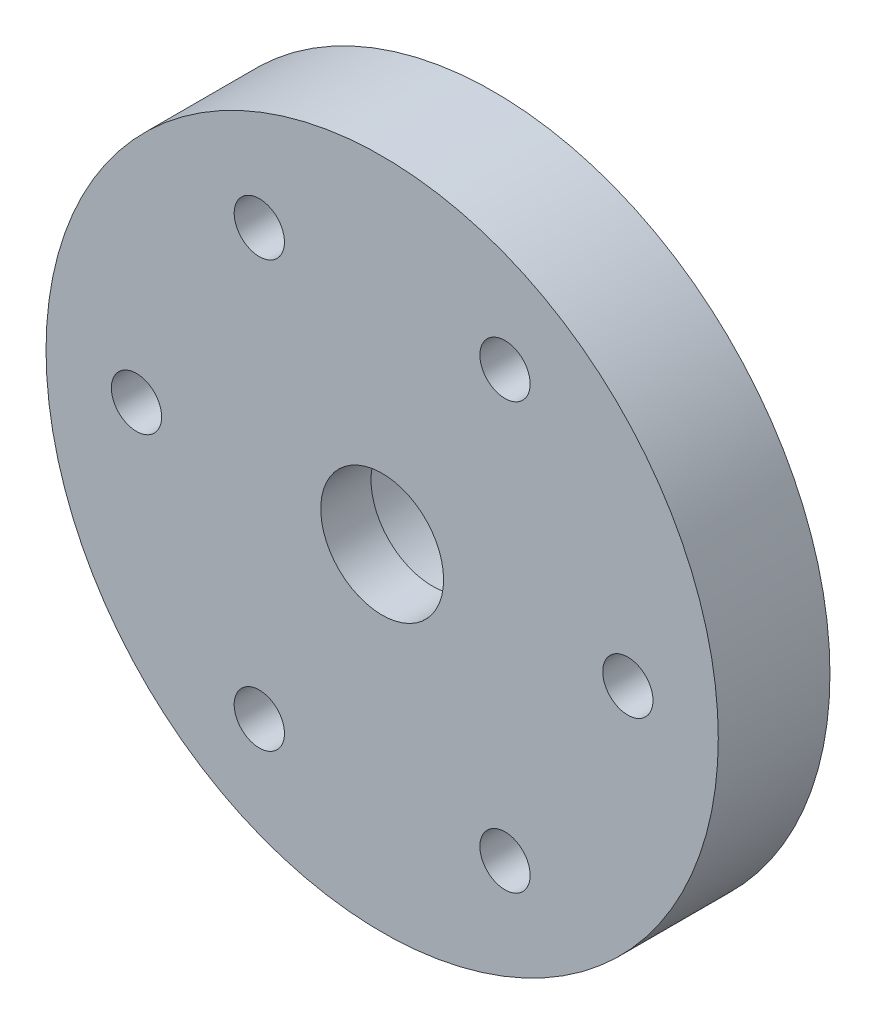
ISO-10303-21;
HEADER;
FILE_DESCRIPTION(('STEP AP214'),'2;1');
FILE_NAME('part.step','',(''),(''),'','','');
FILE_SCHEMA(('AUTOMOTIVE_DESIGN { 1 0 10303 214 1 1 1 1 }'));
ENDSEC;
DATA;
#1=APPLICATION_CONTEXT('core data for automotive mechanical design processes');
#2=APPLICATION_PROTOCOL_DEFINITION('international standard','automotive_design',2000,#1);
#3=PRODUCT_CONTEXT('',#1,'mechanical');
#4=PRODUCT('Part','Part','',(#3));
#5=PRODUCT_RELATED_PRODUCT_CATEGORY('part','',(#4));
#6=PRODUCT_DEFINITION_FORMATION('','',#4);
#7=PRODUCT_DEFINITION_CONTEXT('part definition',#1,'design');
#8=PRODUCT_DEFINITION('design','',#6,#7);
#9=PRODUCT_DEFINITION_SHAPE('','',#8);
#10=(LENGTH_UNIT() NAMED_UNIT(*) SI_UNIT(.MILLI.,.METRE.));
#11=(NAMED_UNIT(*) PLANE_ANGLE_UNIT() SI_UNIT($,.RADIAN.));
#12=(NAMED_UNIT(*) SI_UNIT($,.STERADIAN.) SOLID_ANGLE_UNIT());
#13=UNCERTAINTY_MEASURE_WITH_UNIT(LENGTH_MEASURE(1.E-05),#10,'distance_accuracy_value','');
#14=(GEOMETRIC_REPRESENTATION_CONTEXT(3) GLOBAL_UNCERTAINTY_ASSIGNED_CONTEXT((#13)) GLOBAL_UNIT_ASSIGNED_CONTEXT((#10,
#11,#12)) REPRESENTATION_CONTEXT('',''));
#15=CARTESIAN_POINT('',(0.,0.,0.));
#16=DIRECTION('',(0.,0.,1.));
#17=DIRECTION('',(1.,0.,0.));
#18=AXIS2_PLACEMENT_3D('',#15,#16,#17);
#19=CARTESIAN_POINT('',(0.,0.,10.));
#20=DIRECTION('',(0.,0.,-1.));
#21=DIRECTION('',(-1.,0.,0.));
#22=AXIS2_PLACEMENT_3D('',#19,#20,#21);
#23=CYLINDRICAL_SURFACE('',#22,8.1);
#24=CARTESIAN_POINT('',(0.,0.,0.));
#25=DIRECTION('',(0.,0.,1.));
#26=DIRECTION('',(1.,0.,0.));
#27=AXIS2_PLACEMENT_3D('',#24,#25,#26);
#28=CIRCLE('',#27,8.1);
#29=CARTESIAN_POINT('',(8.1,0.,0.));
#30=VERTEX_POINT('',#29);
#31=EDGE_CURVE('E123',#30,#30,#28,.T.);
#32=ORIENTED_EDGE('',*,*,#31,.F.);
#33=EDGE_LOOP('',(#32));
#34=FACE_BOUND('',#33,.T.);
#35=CARTESIAN_POINT('',(0.,0.,5.5));
#36=DIRECTION('',(0.,0.,1.));
#37=DIRECTION('',(1.,0.,0.));
#38=AXIS2_PLACEMENT_3D('',#35,#36,#37);
#39=CIRCLE('',#38,8.1);
#40=CARTESIAN_POINT('',(8.1,0.,5.5));
#41=VERTEX_POINT('',#40);
#42=EDGE_CURVE('E128',#41,#41,#39,.T.);
#43=ORIENTED_EDGE('',*,*,#42,.T.);
#44=EDGE_LOOP('',(#43));
#45=FACE_BOUND('',#44,.T.);
#46=ADVANCED_FACE('F77',(#34,#45),#23,.F.);
#47=CARTESIAN_POINT('',(0.,0.,10.));
#48=DIRECTION('',(0.,0.,1.));
#49=DIRECTION('',(1.,0.,0.));
#50=AXIS2_PLACEMENT_3D('',#47,#48,#49);
#51=PLANE('',#50);
#52=CARTESIAN_POINT('',(-22.,0.,10.));
#53=DIRECTION('',(0.,0.,1.));
#54=DIRECTION('',(1.,0.,0.));
#55=AXIS2_PLACEMENT_3D('',#52,#53,#54);
#56=CIRCLE('',#55,2.25);
#57=CARTESIAN_POINT('',(-19.75,0.,10.));
#58=VERTEX_POINT('',#57);
#59=EDGE_CURVE('E117',#58,#58,#56,.T.);
#60=ORIENTED_EDGE('',*,*,#59,.F.);
#61=EDGE_LOOP('',(#60));
#62=FACE_BOUND('',#61,.T.);
#63=CARTESIAN_POINT('',(11.,-19.0525588832576,10.));
#64=DIRECTION('',(0.,0.,1.));
#65=DIRECTION('',(1.,0.,0.));
#66=AXIS2_PLACEMENT_3D('',#63,#64,#65);
#67=CIRCLE('',#66,2.25);
#68=CARTESIAN_POINT('',(13.25,-19.0525588832576,10.));
#69=VERTEX_POINT('',#68);
#70=EDGE_CURVE('E110',#69,#69,#67,.T.);
#71=ORIENTED_EDGE('',*,*,#70,.F.);
#72=EDGE_LOOP('',(#71));
#73=FACE_BOUND('',#72,.T.);
#74=CARTESIAN_POINT('',(11.,19.0525588832577,10.));
#75=DIRECTION('',(0.,0.,1.));
#76=DIRECTION('',(1.,0.,0.));
#77=AXIS2_PLACEMENT_3D('',#74,#75,#76);
#78=CIRCLE('',#77,2.25);
#79=CARTESIAN_POINT('',(13.25,19.0525588832577,10.));
#80=VERTEX_POINT('',#79);
#81=EDGE_CURVE('E92',#80,#80,#78,.T.);
#82=ORIENTED_EDGE('',*,*,#81,.F.);
#83=EDGE_LOOP('',(#82));
#84=FACE_BOUND('',#83,.T.);
#85=CARTESIAN_POINT('',(0.,0.,10.));
#86=DIRECTION('',(0.,0.,1.));
#87=DIRECTION('',(1.,0.,0.));
#88=AXIS2_PLACEMENT_3D('',#85,#86,#87);
#89=CIRCLE('',#88,30.1);
#90=CARTESIAN_POINT('',(30.1,0.,10.));
#91=VERTEX_POINT('',#90);
#92=EDGE_CURVE('E11',#91,#91,#89,.T.);
#93=ORIENTED_EDGE('',*,*,#92,.T.);
#94=EDGE_LOOP('',(#93));
#95=FACE_BOUND('',#94,.T.);
#96=CARTESIAN_POINT('',(-11.,19.0525588832576,10.));
#97=DIRECTION('',(0.,0.,1.));
#98=DIRECTION('',(1.,0.,0.));
#99=AXIS2_PLACEMENT_3D('',#96,#97,#98);
#100=CIRCLE('',#99,2.25000000000001);
#101=CARTESIAN_POINT('',(-8.75,19.0525588832576,10.));
#102=VERTEX_POINT('',#101);
#103=EDGE_CURVE('E89',#102,#102,#100,.T.);
#104=ORIENTED_EDGE('',*,*,#103,.F.);
#105=EDGE_LOOP('',(#104));
#106=FACE_BOUND('',#105,.T.);
#107=CARTESIAN_POINT('',(22.,0.,10.));
#108=DIRECTION('',(0.,0.,1.));
#109=DIRECTION('',(1.,0.,0.));
#110=AXIS2_PLACEMENT_3D('',#107,#108,#109);
#111=CIRCLE('',#110,2.25);
#112=CARTESIAN_POINT('',(24.25,0.,10.));
#113=VERTEX_POINT('',#112);
#114=EDGE_CURVE('E101',#113,#113,#111,.T.);
#115=ORIENTED_EDGE('',*,*,#114,.F.);
#116=EDGE_LOOP('',(#115));
#117=FACE_BOUND('',#116,.T.);
#118=CARTESIAN_POINT('',(-11.,-19.0525588832577,10.));
#119=DIRECTION('',(0.,0.,1.));
#120=DIRECTION('',(1.,0.,0.));
#121=AXIS2_PLACEMENT_3D('',#118,#119,#120);
#122=CIRCLE('',#121,2.25);
#123=CARTESIAN_POINT('',(-8.74999999999999,-19.0525588832577,10.));
#124=VERTEX_POINT('',#123);
#125=EDGE_CURVE('E114',#124,#124,#122,.T.);
#126=ORIENTED_EDGE('',*,*,#125,.F.);
#127=EDGE_LOOP('',(#126));
#128=FACE_BOUND('',#127,.T.);
#129=CARTESIAN_POINT('',(0.,0.,10.));
#130=DIRECTION('',(0.,0.,1.));
#131=DIRECTION('',(1.,0.,0.));
#132=AXIS2_PLACEMENT_3D('',#129,#130,#131);
#133=CIRCLE('',#132,5.5);
#134=CARTESIAN_POINT('',(5.5,0.,10.));
#135=VERTEX_POINT('',#134);
#136=EDGE_CURVE('E132',#135,#135,#133,.T.);
#137=ORIENTED_EDGE('',*,*,#136,.F.);
#138=EDGE_LOOP('',(#137));
#139=FACE_BOUND('',#138,.T.);
#140=ADVANCED_FACE('F149',(#62,#73,#84,#95,#106,#117,#128,#139),#51,.T.);
#141=CARTESIAN_POINT('',(0.,0.,0.));
#142=DIRECTION('',(0.,0.,1.));
#143=DIRECTION('',(1.,0.,0.));
#144=AXIS2_PLACEMENT_3D('',#141,#142,#143);
#145=PLANE('',#144);
#146=CARTESIAN_POINT('',(0.,0.,0.));
#147=DIRECTION('',(0.,0.,1.));
#148=DIRECTION('',(1.,0.,0.));
#149=AXIS2_PLACEMENT_3D('',#146,#147,#148);
#150=CIRCLE('',#149,30.1);
#151=CARTESIAN_POINT('',(30.1,0.,0.));
#152=VERTEX_POINT('',#151);
#153=EDGE_CURVE('E85',#152,#152,#150,.T.);
#154=ORIENTED_EDGE('',*,*,#153,.F.);
#155=EDGE_LOOP('',(#154));
#156=FACE_BOUND('',#155,.T.);
#157=CARTESIAN_POINT('',(-11.,19.0525588832576,0.));
#158=DIRECTION('',(0.,0.,1.));
#159=DIRECTION('',(1.,0.,0.));
#160=AXIS2_PLACEMENT_3D('',#157,#158,#159);
#161=CIRCLE('',#160,2.25000000000001);
#162=CARTESIAN_POINT('',(-8.75,19.0525588832576,0.));
#163=VERTEX_POINT('',#162);
#164=EDGE_CURVE('E95',#163,#163,#161,.T.);
#165=ORIENTED_EDGE('',*,*,#164,.T.);
#166=EDGE_LOOP('',(#165));
#167=FACE_BOUND('',#166,.T.);
#168=CARTESIAN_POINT('',(11.,19.0525588832577,0.));
#169=DIRECTION('',(0.,0.,1.));
#170=DIRECTION('',(1.,0.,0.));
#171=AXIS2_PLACEMENT_3D('',#168,#169,#170);
#172=CIRCLE('',#171,2.25);
#173=CARTESIAN_POINT('',(13.25,19.0525588832577,0.));
#174=VERTEX_POINT('',#173);
#175=EDGE_CURVE('E98',#174,#174,#172,.T.);
#176=ORIENTED_EDGE('',*,*,#175,.T.);
#177=EDGE_LOOP('',(#176));
#178=FACE_BOUND('',#177,.T.);
#179=CARTESIAN_POINT('',(22.,0.,0.));
#180=DIRECTION('',(0.,0.,1.));
#181=DIRECTION('',(1.,0.,0.));
#182=AXIS2_PLACEMENT_3D('',#179,#180,#181);
#183=CIRCLE('',#182,2.25);
#184=CARTESIAN_POINT('',(24.25,0.,0.));
#185=VERTEX_POINT('',#184);
#186=EDGE_CURVE('E102',#185,#185,#183,.T.);
#187=ORIENTED_EDGE('',*,*,#186,.T.);
#188=EDGE_LOOP('',(#187));
#189=FACE_BOUND('',#188,.T.);
#190=CARTESIAN_POINT('',(11.,-19.0525588832576,0.));
#191=DIRECTION('',(0.,0.,1.));
#192=DIRECTION('',(1.,0.,0.));
#193=AXIS2_PLACEMENT_3D('',#190,#191,#192);
#194=CIRCLE('',#193,2.25);
#195=CARTESIAN_POINT('',(13.25,-19.0525588832576,0.));
#196=VERTEX_POINT('',#195);
#197=EDGE_CURVE('E109',#196,#196,#194,.T.);
#198=ORIENTED_EDGE('',*,*,#197,.T.);
#199=EDGE_LOOP('',(#198));
#200=FACE_BOUND('',#199,.T.);
#201=CARTESIAN_POINT('',(-11.,-19.0525588832577,0.));
#202=DIRECTION('',(0.,0.,1.));
#203=DIRECTION('',(1.,0.,0.));
#204=AXIS2_PLACEMENT_3D('',#201,#202,#203);
#205=CIRCLE('',#204,2.25);
#206=CARTESIAN_POINT('',(-8.74999999999999,-19.0525588832577,0.));
#207=VERTEX_POINT('',#206);
#208=EDGE_CURVE('E118',#207,#207,#205,.T.);
#209=ORIENTED_EDGE('',*,*,#208,.T.);
#210=EDGE_LOOP('',(#209));
#211=FACE_BOUND('',#210,.T.);
#212=CARTESIAN_POINT('',(-22.,0.,0.));
#213=DIRECTION('',(0.,0.,1.));
#214=DIRECTION('',(1.,0.,0.));
#215=AXIS2_PLACEMENT_3D('',#212,#213,#214);
#216=CIRCLE('',#215,2.25);
#217=CARTESIAN_POINT('',(-19.75,0.,0.));
#218=VERTEX_POINT('',#217);
#219=EDGE_CURVE('E124',#218,#218,#216,.T.);
#220=ORIENTED_EDGE('',*,*,#219,.T.);
#221=EDGE_LOOP('',(#220));
#222=FACE_BOUND('',#221,.T.);
#223=ORIENTED_EDGE('',*,*,#31,.T.);
#224=EDGE_LOOP('',(#223));
#225=FACE_BOUND('',#224,.T.);
#226=ADVANCED_FACE('F151',(#156,#167,#178,#189,#200,#211,#222,#225),#145,.F.);
#227=CARTESIAN_POINT('',(0.,0.,10.));
#228=DIRECTION('',(0.,0.,-1.));
#229=DIRECTION('',(-1.,0.,0.));
#230=AXIS2_PLACEMENT_3D('',#227,#228,#229);
#231=CYLINDRICAL_SURFACE('',#230,30.1);
#232=ORIENTED_EDGE('',*,*,#92,.F.);
#233=EDGE_LOOP('',(#232));
#234=FACE_BOUND('',#233,.T.);
#235=ORIENTED_EDGE('',*,*,#153,.T.);
#236=EDGE_LOOP('',(#235));
#237=FACE_BOUND('',#236,.T.);
#238=ADVANCED_FACE('F82',(#234,#237),#231,.T.);
#239=CARTESIAN_POINT('',(-11.,19.0525588832576,10.));
#240=DIRECTION('',(0.,0.,-1.));
#241=DIRECTION('',(-1.,0.,0.));
#242=AXIS2_PLACEMENT_3D('',#239,#240,#241);
#243=CYLINDRICAL_SURFACE('',#242,2.25000000000001);
#244=ORIENTED_EDGE('',*,*,#103,.T.);
#245=EDGE_LOOP('',(#244));
#246=FACE_BOUND('',#245,.T.);
#247=ORIENTED_EDGE('',*,*,#164,.F.);
#248=EDGE_LOOP('',(#247));
#249=FACE_BOUND('',#248,.T.);
#250=ADVANCED_FACE('F164',(#246,#249),#243,.F.);
#251=CARTESIAN_POINT('',(11.,19.0525588832577,10.));
#252=DIRECTION('',(0.,0.,-1.));
#253=DIRECTION('',(-1.,0.,0.));
#254=AXIS2_PLACEMENT_3D('',#251,#252,#253);
#255=CYLINDRICAL_SURFACE('',#254,2.25);
#256=ORIENTED_EDGE('',*,*,#81,.T.);
#257=EDGE_LOOP('',(#256));
#258=FACE_BOUND('',#257,.T.);
#259=ORIENTED_EDGE('',*,*,#175,.F.);
#260=EDGE_LOOP('',(#259));
#261=FACE_BOUND('',#260,.T.);
#262=ADVANCED_FACE('F169',(#258,#261),#255,.F.);
#263=CARTESIAN_POINT('',(22.,0.,10.));
#264=DIRECTION('',(0.,0.,-1.));
#265=DIRECTION('',(-1.,0.,0.));
#266=AXIS2_PLACEMENT_3D('',#263,#264,#265);
#267=CYLINDRICAL_SURFACE('',#266,2.25);
#268=ORIENTED_EDGE('',*,*,#114,.T.);
#269=EDGE_LOOP('',(#268));
#270=FACE_BOUND('',#269,.T.);
#271=ORIENTED_EDGE('',*,*,#186,.F.);
#272=EDGE_LOOP('',(#271));
#273=FACE_BOUND('',#272,.T.);
#274=ADVANCED_FACE('F175',(#270,#273),#267,.F.);
#275=CARTESIAN_POINT('',(11.,-19.0525588832576,10.));
#276=DIRECTION('',(0.,0.,-1.));
#277=DIRECTION('',(-1.,0.,0.));
#278=AXIS2_PLACEMENT_3D('',#275,#276,#277);
#279=CYLINDRICAL_SURFACE('',#278,2.25);
#280=ORIENTED_EDGE('',*,*,#70,.T.);
#281=EDGE_LOOP('',(#280));
#282=FACE_BOUND('',#281,.T.);
#283=ORIENTED_EDGE('',*,*,#197,.F.);
#284=EDGE_LOOP('',(#283));
#285=FACE_BOUND('',#284,.T.);
#286=ADVANCED_FACE('F177',(#282,#285),#279,.F.);
#287=CARTESIAN_POINT('',(-11.,-19.0525588832577,10.));
#288=DIRECTION('',(0.,0.,-1.));
#289=DIRECTION('',(-1.,0.,0.));
#290=AXIS2_PLACEMENT_3D('',#287,#288,#289);
#291=CYLINDRICAL_SURFACE('',#290,2.25);
#292=ORIENTED_EDGE('',*,*,#125,.T.);
#293=EDGE_LOOP('',(#292));
#294=FACE_BOUND('',#293,.T.);
#295=ORIENTED_EDGE('',*,*,#208,.F.);
#296=EDGE_LOOP('',(#295));
#297=FACE_BOUND('',#296,.T.);
#298=ADVANCED_FACE('F178',(#294,#297),#291,.F.);
#299=CARTESIAN_POINT('',(-22.,0.,10.));
#300=DIRECTION('',(0.,0.,-1.));
#301=DIRECTION('',(-1.,0.,0.));
#302=AXIS2_PLACEMENT_3D('',#299,#300,#301);
#303=CYLINDRICAL_SURFACE('',#302,2.25);
#304=ORIENTED_EDGE('',*,*,#59,.T.);
#305=EDGE_LOOP('',(#304));
#306=FACE_BOUND('',#305,.T.);
#307=ORIENTED_EDGE('',*,*,#219,.F.);
#308=EDGE_LOOP('',(#307));
#309=FACE_BOUND('',#308,.T.);
#310=ADVANCED_FACE('F184',(#306,#309),#303,.F.);
#311=CARTESIAN_POINT('',(0.,0.,5.5));
#312=DIRECTION('',(0.,0.,1.));
#313=DIRECTION('',(1.,0.,0.));
#314=AXIS2_PLACEMENT_3D('',#311,#312,#313);
#315=PLANE('',#314);
#316=CARTESIAN_POINT('',(0.,0.,5.5));
#317=DIRECTION('',(0.,0.,1.));
#318=DIRECTION('',(1.,0.,0.));
#319=AXIS2_PLACEMENT_3D('',#316,#317,#318);
#320=CIRCLE('',#319,5.5);
#321=CARTESIAN_POINT('',(5.5,0.,5.5));
#322=VERTEX_POINT('',#321);
#323=EDGE_CURVE('E131',#322,#322,#320,.T.);
#324=ORIENTED_EDGE('',*,*,#323,.T.);
#325=EDGE_LOOP('',(#324));
#326=FACE_BOUND('',#325,.T.);
#327=ORIENTED_EDGE('',*,*,#42,.F.);
#328=EDGE_LOOP('',(#327));
#329=FACE_BOUND('',#328,.T.);
#330=ADVANCED_FACE('F138',(#326,#329),#315,.F.);
#331=CARTESIAN_POINT('',(0.,0.,5.5));
#332=DIRECTION('',(0.,0.,1.));
#333=DIRECTION('',(1.,0.,0.));
#334=AXIS2_PLACEMENT_3D('',#331,#332,#333);
#335=CYLINDRICAL_SURFACE('',#334,5.5);
#336=ORIENTED_EDGE('',*,*,#323,.F.);
#337=EDGE_LOOP('',(#336));
#338=FACE_BOUND('',#337,.T.);
#339=ORIENTED_EDGE('',*,*,#136,.T.);
#340=EDGE_LOOP('',(#339));
#341=FACE_BOUND('',#340,.T.);
#342=ADVANCED_FACE('F141',(#338,#341),#335,.F.);
#343=CLOSED_SHELL('',(#46,#140,#226,#238,#250,#262,#274,#286,#298,#310,#330,#342));
#344=MANIFOLD_SOLID_BREP('B2',#343);
#345=ADVANCED_BREP_SHAPE_REPRESENTATION('',(#18,#344),#14);
#346=SHAPE_DEFINITION_REPRESENTATION(#9,#345);
ENDSEC;
END-ISO-10303-21;
